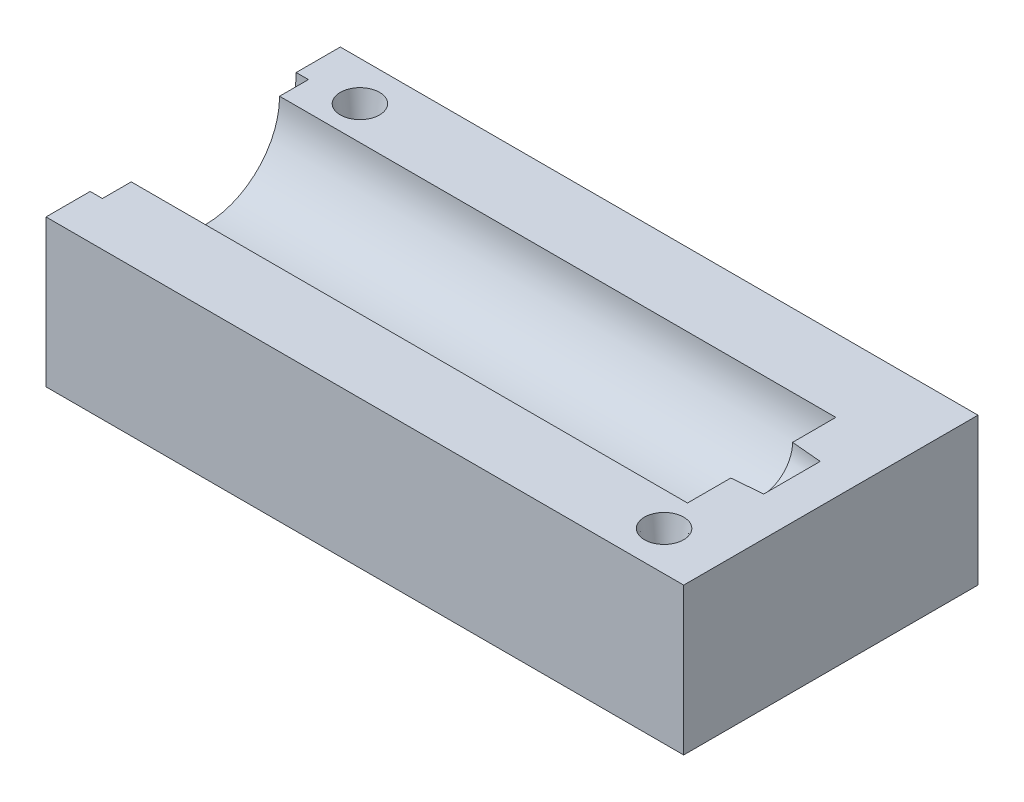
ISO-10303-21;
HEADER;
FILE_DESCRIPTION(('STEP AP214'),'2;1');
FILE_NAME('part.step','',(''),(''),'','','');
FILE_SCHEMA(('AUTOMOTIVE_DESIGN { 1 0 10303 214 1 1 1 1 }'));
ENDSEC;
DATA;
#1=APPLICATION_CONTEXT('core data for automotive mechanical design processes');
#2=APPLICATION_PROTOCOL_DEFINITION('international standard','automotive_design',2000,#1);
#3=PRODUCT_CONTEXT('',#1,'mechanical');
#4=PRODUCT('Part','Part','',(#3));
#5=PRODUCT_RELATED_PRODUCT_CATEGORY('part','',(#4));
#6=PRODUCT_DEFINITION_FORMATION('','',#4);
#7=PRODUCT_DEFINITION_CONTEXT('part definition',#1,'design');
#8=PRODUCT_DEFINITION('design','',#6,#7);
#9=PRODUCT_DEFINITION_SHAPE('','',#8);
#10=(LENGTH_UNIT() NAMED_UNIT(*) SI_UNIT(.MILLI.,.METRE.));
#11=(NAMED_UNIT(*) PLANE_ANGLE_UNIT() SI_UNIT($,.RADIAN.));
#12=(NAMED_UNIT(*) SI_UNIT($,.STERADIAN.) SOLID_ANGLE_UNIT());
#13=UNCERTAINTY_MEASURE_WITH_UNIT(LENGTH_MEASURE(1.E-05),#10,'distance_accuracy_value','');
#14=(GEOMETRIC_REPRESENTATION_CONTEXT(3) GLOBAL_UNCERTAINTY_ASSIGNED_CONTEXT((#13)) GLOBAL_UNIT_ASSIGNED_CONTEXT((#10,
#11,#12)) REPRESENTATION_CONTEXT('',''));
#15=CARTESIAN_POINT('',(0.,0.,0.));
#16=DIRECTION('',(0.,0.,1.));
#17=DIRECTION('',(1.,0.,0.));
#18=AXIS2_PLACEMENT_3D('',#15,#16,#17);
#19=CARTESIAN_POINT('',(0.,0.,0.));
#20=DIRECTION('',(0.,1.,0.));
#21=DIRECTION('',(0.,0.,1.));
#22=AXIS2_PLACEMENT_3D('',#19,#20,#21);
#23=PLANE('',#22);
#24=CARTESIAN_POINT('',(26.5,0.,26.));
#25=DIRECTION('',(0.,1.,0.));
#26=DIRECTION('',(0.,0.,1.));
#27=AXIS2_PLACEMENT_3D('',#24,#25,#26);
#28=CIRCLE('',#27,2.00000000000001);
#29=CARTESIAN_POINT('',(26.5,0.,28.));
#30=VERTEX_POINT('',#29);
#31=EDGE_CURVE('E268',#30,#30,#28,.F.);
#32=ORIENTED_EDGE('',*,*,#31,.T.);
#33=EDGE_LOOP('',(#32));
#34=FACE_BOUND('',#33,.T.);
#35=CARTESIAN_POINT('',(-26.5,0.,4.));
#36=DIRECTION('',(0.,1.,0.));
#37=DIRECTION('',(0.,0.,1.));
#38=AXIS2_PLACEMENT_3D('',#35,#36,#37);
#39=CIRCLE('',#38,2.);
#40=CARTESIAN_POINT('',(-26.5,0.,6.));
#41=VERTEX_POINT('',#40);
#42=EDGE_CURVE('E145',#41,#41,#39,.F.);
#43=ORIENTED_EDGE('',*,*,#42,.T.);
#44=EDGE_LOOP('',(#43));
#45=FACE_BOUND('',#44,.T.);
#46=DIRECTION('',(0.,0.,-1.));
#47=VECTOR('',#46,1.);
#48=CARTESIAN_POINT('',(32.5,0.,30.));
#49=LINE('',#48,#47);
#50=CARTESIAN_POINT('',(32.5,0.,30.));
#51=VERTEX_POINT('',#50);
#52=CARTESIAN_POINT('',(32.5,0.,0.));
#53=VERTEX_POINT('',#52);
#54=EDGE_CURVE('E135',#51,#53,#49,.T.);
#55=ORIENTED_EDGE('',*,*,#54,.T.);
#56=DIRECTION('',(-1.,0.,0.));
#57=VECTOR('',#56,1.);
#58=CARTESIAN_POINT('',(0.,0.,0.));
#59=LINE('',#58,#57);
#60=CARTESIAN_POINT('',(-32.5,0.,0.));
#61=VERTEX_POINT('',#60);
#62=EDGE_CURVE('E118',#53,#61,#59,.T.);
#63=ORIENTED_EDGE('',*,*,#62,.T.);
#64=DIRECTION('',(0.,0.,1.));
#65=VECTOR('',#64,1.);
#66=CARTESIAN_POINT('',(-32.5,0.,30.));
#67=LINE('',#66,#65);
#68=CARTESIAN_POINT('',(-32.5,0.,4.5));
#69=VERTEX_POINT('',#68);
#70=EDGE_CURVE('E125',#61,#69,#67,.T.);
#71=ORIENTED_EDGE('',*,*,#70,.T.);
#72=DIRECTION('',(1.,0.,0.));
#73=VECTOR('',#72,1.);
#74=CARTESIAN_POINT('',(-35.4507407230331,0.,4.5));
#75=LINE('',#74,#73);
#76=CARTESIAN_POINT('',(-31.2507407230331,0.,4.5));
#77=VERTEX_POINT('',#76);
#78=EDGE_CURVE('E174',#77,#69,#75,.F.);
#79=ORIENTED_EDGE('',*,*,#78,.F.);
#80=DIRECTION('',(0.,0.,-1.));
#81=VECTOR('',#80,1.);
#82=CARTESIAN_POINT('',(-31.2507407230331,0.,15.));
#83=LINE('',#82,#81);
#84=CARTESIAN_POINT('',(-31.2507407230331,0.,7.44));
#85=VERTEX_POINT('',#84);
#86=EDGE_CURVE('E170',#85,#77,#83,.T.);
#87=ORIENTED_EDGE('',*,*,#86,.F.);
#88=DIRECTION('',(-1.,0.,0.));
#89=VECTOR('',#88,1.);
#90=CARTESIAN_POINT('',(25.4492592769669,0.,7.44));
#91=LINE('',#90,#89);
#92=CARTESIAN_POINT('',(25.4492592769669,0.,7.44));
#93=VERTEX_POINT('',#92);
#94=EDGE_CURVE('E197',#93,#85,#91,.T.);
#95=ORIENTED_EDGE('',*,*,#94,.F.);
#96=DIRECTION('',(0.,0.,1.));
#97=VECTOR('',#96,1.);
#98=CARTESIAN_POINT('',(25.4492592769669,0.,15.));
#99=LINE('',#98,#97);
#100=CARTESIAN_POINT('',(25.4492592769669,0.,11.85));
#101=VERTEX_POINT('',#100);
#102=EDGE_CURVE('E136',#93,#101,#99,.T.);
#103=ORIENTED_EDGE('',*,*,#102,.T.);
#104=DIRECTION('',(-0.996194698091746,0.,-0.0871557427476584));
#105=VECTOR('',#104,1.);
#106=CARTESIAN_POINT('',(61.4539240306651,0.,15.));
#107=LINE('',#106,#105);
#108=CARTESIAN_POINT('',(28.539259276967,0.,12.1203399702951));
#109=VERTEX_POINT('',#108);
#110=EDGE_CURVE('E69',#109,#101,#107,.T.);
#111=ORIENTED_EDGE('',*,*,#110,.F.);
#112=DIRECTION('',(0.,0.,1.));
#113=VECTOR('',#112,1.);
#114=CARTESIAN_POINT('',(28.539259276967,0.,15.));
#115=LINE('',#114,#113);
#116=CARTESIAN_POINT('',(28.539259276967,0.,17.8796600297049));
#117=VERTEX_POINT('',#116);
#118=EDGE_CURVE('E143',#109,#117,#115,.T.);
#119=ORIENTED_EDGE('',*,*,#118,.T.);
#120=DIRECTION('',(0.996194698091746,0.,-0.0871557427476584));
#121=VECTOR('',#120,1.);
#122=CARTESIAN_POINT('',(61.4539240306651,0.,15.));
#123=LINE('',#122,#121);
#124=CARTESIAN_POINT('',(25.4492592769669,0.,18.15));
#125=VERTEX_POINT('',#124);
#126=EDGE_CURVE('E192',#125,#117,#123,.T.);
#127=ORIENTED_EDGE('',*,*,#126,.F.);
#128=CARTESIAN_POINT('',(25.4492592769669,0.,22.56));
#129=VERTEX_POINT('',#128);
#130=EDGE_CURVE('E139',#125,#129,#99,.T.);
#131=ORIENTED_EDGE('',*,*,#130,.T.);
#132=DIRECTION('',(-1.,0.,0.));
#133=VECTOR('',#132,1.);
#134=CARTESIAN_POINT('',(25.4492592769669,0.,22.56));
#135=LINE('',#134,#133);
#136=CARTESIAN_POINT('',(-31.2507407230331,0.,22.56));
#137=VERTEX_POINT('',#136);
#138=EDGE_CURVE('E195',#137,#129,#135,.F.);
#139=ORIENTED_EDGE('',*,*,#138,.F.);
#140=CARTESIAN_POINT('',(-31.2507407230331,0.,25.5));
#141=VERTEX_POINT('',#140);
#142=EDGE_CURVE('E168',#141,#137,#83,.T.);
#143=ORIENTED_EDGE('',*,*,#142,.F.);
#144=DIRECTION('',(1.,0.,0.));
#145=VECTOR('',#144,1.);
#146=CARTESIAN_POINT('',(-35.4507407230331,0.,25.5));
#147=LINE('',#146,#145);
#148=CARTESIAN_POINT('',(-32.5,0.,25.5));
#149=VERTEX_POINT('',#148);
#150=EDGE_CURVE('E175',#149,#141,#147,.T.);
#151=ORIENTED_EDGE('',*,*,#150,.F.);
#152=CARTESIAN_POINT('',(-32.5,0.,30.));
#153=VERTEX_POINT('',#152);
#154=EDGE_CURVE('E131',#149,#153,#67,.T.);
#155=ORIENTED_EDGE('',*,*,#154,.T.);
#156=DIRECTION('',(-1.,0.,0.));
#157=VECTOR('',#156,1.);
#158=CARTESIAN_POINT('',(0.,0.,30.));
#159=LINE('',#158,#157);
#160=EDGE_CURVE('E130',#51,#153,#159,.T.);
#161=ORIENTED_EDGE('',*,*,#160,.F.);
#162=EDGE_LOOP('',(#55,#63,#71,#79,#87,#95,#103,#111,#119,#127,#131,#139,#143,#151,#155,#161));
#163=FACE_BOUND('',#162,.T.);
#164=ADVANCED_FACE('F32',(#34,#45,#163),#23,.T.);
#165=CARTESIAN_POINT('',(-32.5,-15.,30.));
#166=DIRECTION('',(1.,0.,0.));
#167=DIRECTION('',(0.,0.,-1.));
#168=AXIS2_PLACEMENT_3D('',#165,#166,#167);
#169=PLANE('',#168);
#170=ORIENTED_EDGE('',*,*,#70,.F.);
#171=DIRECTION('',(0.,-1.,0.));
#172=VECTOR('',#171,1.);
#173=CARTESIAN_POINT('',(-32.5,-15.,0.));
#174=LINE('',#173,#172);
#175=CARTESIAN_POINT('',(-32.5,-15.,0.));
#176=VERTEX_POINT('',#175);
#177=EDGE_CURVE('E49',#61,#176,#174,.T.);
#178=ORIENTED_EDGE('',*,*,#177,.T.);
#179=DIRECTION('',(0.,0.,-1.));
#180=VECTOR('',#179,1.);
#181=CARTESIAN_POINT('',(-32.5,-15.,30.));
#182=LINE('',#181,#180);
#183=CARTESIAN_POINT('',(-32.5,-15.,30.));
#184=VERTEX_POINT('',#183);
#185=EDGE_CURVE('E182',#184,#176,#182,.T.);
#186=ORIENTED_EDGE('',*,*,#185,.F.);
#187=DIRECTION('',(0.,-1.,0.));
#188=VECTOR('',#187,1.);
#189=CARTESIAN_POINT('',(-32.5,-15.,30.));
#190=LINE('',#189,#188);
#191=EDGE_CURVE('E149',#153,#184,#190,.T.);
#192=ORIENTED_EDGE('',*,*,#191,.F.);
#193=ORIENTED_EDGE('',*,*,#154,.F.);
#194=CARTESIAN_POINT('',(-32.5,0.,15.));
#195=DIRECTION('',(1.,0.,0.));
#196=DIRECTION('',(0.,0.,-1.));
#197=AXIS2_PLACEMENT_3D('',#194,#195,#196);
#198=CIRCLE('',#197,10.5);
#199=EDGE_CURVE('E121',#69,#149,#198,.F.);
#200=ORIENTED_EDGE('',*,*,#199,.F.);
#201=EDGE_LOOP('',(#170,#178,#186,#192,#193,#200));
#202=FACE_BOUND('',#201,.T.);
#203=ADVANCED_FACE('F126',(#202),#169,.F.);
#204=CARTESIAN_POINT('',(-35.4507407230331,0.,15.));
#205=DIRECTION('',(1.,0.,0.));
#206=DIRECTION('',(0.,-1.,0.));
#207=AXIS2_PLACEMENT_3D('',#204,#205,#206);
#208=CYLINDRICAL_SURFACE('',#207,10.5);
#209=ORIENTED_EDGE('',*,*,#199,.T.);
#210=ORIENTED_EDGE('',*,*,#150,.T.);
#211=CARTESIAN_POINT('',(-31.2507407230331,0.,15.));
#212=DIRECTION('',(-1.,0.,0.));
#213=DIRECTION('',(0.,1.,0.));
#214=AXIS2_PLACEMENT_3D('',#211,#212,#213);
#215=CIRCLE('',#214,10.5);
#216=EDGE_CURVE('E41',#77,#141,#215,.T.);
#217=ORIENTED_EDGE('',*,*,#216,.F.);
#218=ORIENTED_EDGE('',*,*,#78,.T.);
#219=EDGE_LOOP('',(#209,#210,#217,#218));
#220=FACE_BOUND('',#219,.T.);
#221=ADVANCED_FACE('F173',(#220),#208,.F.);
#222=CARTESIAN_POINT('',(-31.2507407230331,0.,15.));
#223=DIRECTION('',(-1.,0.,0.));
#224=DIRECTION('',(0.,1.,0.));
#225=AXIS2_PLACEMENT_3D('',#222,#223,#224);
#226=PLANE('',#225);
#227=ORIENTED_EDGE('',*,*,#216,.T.);
#228=ORIENTED_EDGE('',*,*,#142,.T.);
#229=CARTESIAN_POINT('',(-31.2507407230331,0.,15.));
#230=DIRECTION('',(-1.,0.,0.));
#231=DIRECTION('',(0.,-1.,0.));
#232=AXIS2_PLACEMENT_3D('',#229,#230,#231);
#233=CIRCLE('',#232,7.56);
#234=EDGE_CURVE('E160',#85,#137,#233,.T.);
#235=ORIENTED_EDGE('',*,*,#234,.F.);
#236=ORIENTED_EDGE('',*,*,#86,.T.);
#237=EDGE_LOOP('',(#227,#228,#235,#236));
#238=FACE_BOUND('',#237,.T.);
#239=ADVANCED_FACE('F166',(#238),#226,.T.);
#240=CARTESIAN_POINT('',(25.4492592769669,0.,15.));
#241=DIRECTION('',(1.,0.,0.));
#242=DIRECTION('',(0.,0.,-1.));
#243=AXIS2_PLACEMENT_3D('',#240,#241,#242);
#244=PLANE('',#243);
#245=ORIENTED_EDGE('',*,*,#102,.F.);
#246=CARTESIAN_POINT('',(25.4492592769669,0.,15.));
#247=DIRECTION('',(1.,0.,0.));
#248=DIRECTION('',(0.,0.,-1.));
#249=AXIS2_PLACEMENT_3D('',#246,#247,#248);
#250=CIRCLE('',#249,7.56);
#251=EDGE_CURVE('E154',#129,#93,#250,.T.);
#252=ORIENTED_EDGE('',*,*,#251,.F.);
#253=ORIENTED_EDGE('',*,*,#130,.F.);
#254=CARTESIAN_POINT('',(25.4492592769669,0.,15.));
#255=DIRECTION('',(1.,0.,0.));
#256=DIRECTION('',(0.,0.,-1.));
#257=AXIS2_PLACEMENT_3D('',#254,#255,#256);
#258=CIRCLE('',#257,3.15);
#259=EDGE_CURVE('E157',#125,#101,#258,.T.);
#260=ORIENTED_EDGE('',*,*,#259,.T.);
#261=EDGE_LOOP('',(#245,#252,#253,#260));
#262=FACE_BOUND('',#261,.T.);
#263=ADVANCED_FACE('F203',(#262),#244,.F.);
#264=CARTESIAN_POINT('',(28.539259276967,2.13084710756668E-13,15.));
#265=DIRECTION('',(1.,0.,0.));
#266=DIRECTION('',(0.,-1.,0.));
#267=AXIS2_PLACEMENT_3D('',#264,#265,#266);
#268=PLANE('',#267);
#269=ORIENTED_EDGE('',*,*,#118,.F.);
#270=CARTESIAN_POINT('',(28.539259276967,2.13084710756668E-13,15.));
#271=DIRECTION('',(1.,0.,0.));
#272=DIRECTION('',(0.,-1.,0.));
#273=AXIS2_PLACEMENT_3D('',#270,#271,#272);
#274=CIRCLE('',#273,2.87966002970489);
#275=EDGE_CURVE('E11',#117,#109,#274,.T.);
#276=ORIENTED_EDGE('',*,*,#275,.F.);
#277=EDGE_LOOP('',(#269,#276));
#278=FACE_BOUND('',#277,.T.);
#279=ADVANCED_FACE('F209',(#278),#268,.F.);
#280=CARTESIAN_POINT('',(25.449259276967,2.02296033419642E-13,15.));
#281=DIRECTION('',(-1.,0.,0.));
#282=DIRECTION('',(0.,-1.,0.));
#283=AXIS2_PLACEMENT_3D('',#280,#281,#282);
#284=CONICAL_SURFACE('',#283,3.15,0.0872664625997167);
#285=ORIENTED_EDGE('',*,*,#275,.T.);
#286=ORIENTED_EDGE('',*,*,#110,.T.);
#287=ORIENTED_EDGE('',*,*,#259,.F.);
#288=ORIENTED_EDGE('',*,*,#126,.T.);
#289=EDGE_LOOP('',(#285,#286,#287,#288));
#290=FACE_BOUND('',#289,.T.);
#291=ADVANCED_FACE('F34',(#290),#284,.F.);
#292=CARTESIAN_POINT('',(25.4492592769669,0.,15.));
#293=DIRECTION('',(-1.,0.,0.));
#294=DIRECTION('',(0.,0.,1.));
#295=AXIS2_PLACEMENT_3D('',#292,#293,#294);
#296=CYLINDRICAL_SURFACE('',#295,7.56);
#297=ORIENTED_EDGE('',*,*,#251,.T.);
#298=ORIENTED_EDGE('',*,*,#94,.T.);
#299=ORIENTED_EDGE('',*,*,#234,.T.);
#300=ORIENTED_EDGE('',*,*,#138,.T.);
#301=EDGE_LOOP('',(#297,#298,#299,#300));
#302=FACE_BOUND('',#301,.T.);
#303=ADVANCED_FACE('F199',(#302),#296,.F.);
#304=CARTESIAN_POINT('',(32.5,-15.,30.));
#305=DIRECTION('',(0.,1.,0.));
#306=DIRECTION('',(-1.,0.,0.));
#307=AXIS2_PLACEMENT_3D('',#304,#305,#306);
#308=PLANE('',#307);
#309=DIRECTION('',(1.,0.,0.));
#310=VECTOR('',#309,1.);
#311=CARTESIAN_POINT('',(32.5,-15.,0.));
#312=LINE('',#311,#310);
#313=CARTESIAN_POINT('',(32.5,-15.,0.));
#314=VERTEX_POINT('',#313);
#315=EDGE_CURVE('E119',#176,#314,#312,.T.);
#316=ORIENTED_EDGE('',*,*,#315,.T.);
#317=DIRECTION('',(0.,0.,-1.));
#318=VECTOR('',#317,1.);
#319=CARTESIAN_POINT('',(32.5,-15.,30.));
#320=LINE('',#319,#318);
#321=CARTESIAN_POINT('',(32.5,-15.,30.));
#322=VERTEX_POINT('',#321);
#323=EDGE_CURVE('E148',#322,#314,#320,.T.);
#324=ORIENTED_EDGE('',*,*,#323,.F.);
#325=DIRECTION('',(1.,0.,0.));
#326=VECTOR('',#325,1.);
#327=CARTESIAN_POINT('',(32.5,-15.,30.));
#328=LINE('',#327,#326);
#329=EDGE_CURVE('E61',#184,#322,#328,.T.);
#330=ORIENTED_EDGE('',*,*,#329,.F.);
#331=ORIENTED_EDGE('',*,*,#185,.T.);
#332=EDGE_LOOP('',(#316,#324,#330,#331));
#333=FACE_BOUND('',#332,.T.);
#334=ADVANCED_FACE('F185',(#333),#308,.F.);
#335=CARTESIAN_POINT('',(32.5,-15.,30.));
#336=DIRECTION('',(-1.,0.,0.));
#337=DIRECTION('',(0.,0.,1.));
#338=AXIS2_PLACEMENT_3D('',#335,#336,#337);
#339=PLANE('',#338);
#340=ORIENTED_EDGE('',*,*,#54,.F.);
#341=DIRECTION('',(0.,1.,0.));
#342=VECTOR('',#341,1.);
#343=CARTESIAN_POINT('',(32.5,-15.,30.));
#344=LINE('',#343,#342);
#345=EDGE_CURVE('E146',#322,#51,#344,.T.);
#346=ORIENTED_EDGE('',*,*,#345,.F.);
#347=ORIENTED_EDGE('',*,*,#323,.T.);
#348=DIRECTION('',(0.,1.,0.));
#349=VECTOR('',#348,1.);
#350=CARTESIAN_POINT('',(32.5,-15.,0.));
#351=LINE('',#350,#349);
#352=EDGE_CURVE('E151',#314,#53,#351,.T.);
#353=ORIENTED_EDGE('',*,*,#352,.T.);
#354=EDGE_LOOP('',(#340,#346,#347,#353));
#355=FACE_BOUND('',#354,.T.);
#356=ADVANCED_FACE('F230',(#355),#339,.F.);
#357=CARTESIAN_POINT('',(0.,0.,0.));
#358=DIRECTION('',(0.,0.,1.));
#359=DIRECTION('',(1.,0.,0.));
#360=AXIS2_PLACEMENT_3D('',#357,#358,#359);
#361=PLANE('',#360);
#362=ORIENTED_EDGE('',*,*,#62,.F.);
#363=ORIENTED_EDGE('',*,*,#352,.F.);
#364=ORIENTED_EDGE('',*,*,#315,.F.);
#365=ORIENTED_EDGE('',*,*,#177,.F.);
#366=EDGE_LOOP('',(#362,#363,#364,#365));
#367=FACE_BOUND('',#366,.T.);
#368=ADVANCED_FACE('F115',(#367),#361,.F.);
#369=CARTESIAN_POINT('',(0.,0.,30.));
#370=DIRECTION('',(0.,0.,1.));
#371=DIRECTION('',(1.,0.,0.));
#372=AXIS2_PLACEMENT_3D('',#369,#370,#371);
#373=PLANE('',#372);
#374=ORIENTED_EDGE('',*,*,#345,.T.);
#375=ORIENTED_EDGE('',*,*,#160,.T.);
#376=ORIENTED_EDGE('',*,*,#191,.T.);
#377=ORIENTED_EDGE('',*,*,#329,.T.);
#378=EDGE_LOOP('',(#374,#375,#376,#377));
#379=FACE_BOUND('',#378,.T.);
#380=ADVANCED_FACE('F183',(#379),#373,.T.);
#381=CARTESIAN_POINT('',(-26.5,-5.,4.));
#382=DIRECTION('',(0.,-1.,0.));
#383=DIRECTION('',(0.,0.,-1.));
#384=AXIS2_PLACEMENT_3D('',#381,#382,#383);
#385=PLANE('',#384);
#386=CARTESIAN_POINT('',(-26.5,-5.,4.));
#387=DIRECTION('',(0.,-1.,0.));
#388=DIRECTION('',(0.,0.,-1.));
#389=AXIS2_PLACEMENT_3D('',#386,#387,#388);
#390=CIRCLE('',#389,1.11836509645768);
#391=CARTESIAN_POINT('',(-26.5,-5.,2.88163490354232));
#392=VERTEX_POINT('',#391);
#393=EDGE_CURVE('E264',#392,#392,#390,.T.);
#394=ORIENTED_EDGE('',*,*,#393,.F.);
#395=EDGE_LOOP('',(#394));
#396=FACE_BOUND('',#395,.T.);
#397=ADVANCED_FACE('F227',(#396),#385,.F.);
#398=CARTESIAN_POINT('',(-26.5,0.,4.));
#399=DIRECTION('',(0.,1.,0.));
#400=DIRECTION('',(0.,0.,-1.));
#401=AXIS2_PLACEMENT_3D('',#398,#399,#400);
#402=CONICAL_SURFACE('',#401,2.,0.174532925199433);
#403=ORIENTED_EDGE('',*,*,#393,.T.);
#404=EDGE_LOOP('',(#403));
#405=FACE_BOUND('',#404,.T.);
#406=ORIENTED_EDGE('',*,*,#42,.F.);
#407=EDGE_LOOP('',(#406));
#408=FACE_BOUND('',#407,.T.);
#409=ADVANCED_FACE('F251',(#405,#408),#402,.F.);
#410=CARTESIAN_POINT('',(26.5,0.,26.));
#411=DIRECTION('',(0.,1.,0.));
#412=DIRECTION('',(0.,0.,-1.));
#413=AXIS2_PLACEMENT_3D('',#410,#411,#412);
#414=CONICAL_SURFACE('',#413,2.00000000000001,0.174532925199433);
#415=CARTESIAN_POINT('',(26.5,-5.,26.));
#416=DIRECTION('',(0.,-1.,0.));
#417=DIRECTION('',(0.,0.,-1.));
#418=AXIS2_PLACEMENT_3D('',#415,#416,#417);
#419=CIRCLE('',#418,1.11836509645768);
#420=CARTESIAN_POINT('',(26.5,-5.,24.8816349035423));
#421=VERTEX_POINT('',#420);
#422=EDGE_CURVE('E265',#421,#421,#419,.T.);
#423=ORIENTED_EDGE('',*,*,#422,.T.);
#424=EDGE_LOOP('',(#423));
#425=FACE_BOUND('',#424,.T.);
#426=ORIENTED_EDGE('',*,*,#31,.F.);
#427=EDGE_LOOP('',(#426));
#428=FACE_BOUND('',#427,.T.);
#429=ADVANCED_FACE('F247',(#425,#428),#414,.F.);
#430=CARTESIAN_POINT('',(26.5,-5.,26.));
#431=DIRECTION('',(0.,-1.,0.));
#432=DIRECTION('',(0.,0.,-1.));
#433=AXIS2_PLACEMENT_3D('',#430,#431,#432);
#434=PLANE('',#433);
#435=ORIENTED_EDGE('',*,*,#422,.F.);
#436=EDGE_LOOP('',(#435));
#437=FACE_BOUND('',#436,.T.);
#438=ADVANCED_FACE('F250',(#437),#434,.F.);
#439=CLOSED_SHELL('',(#164,#203,#221,#239,#263,#279,#291,#303,#334,#356,#368,#380,#397,#409,
#429,#438));
#440=MANIFOLD_SOLID_BREP('B2',#439);
#441=ADVANCED_BREP_SHAPE_REPRESENTATION('',(#18,#440),#14);
#442=SHAPE_DEFINITION_REPRESENTATION(#9,#441);
ENDSEC;
END-ISO-10303-21;
